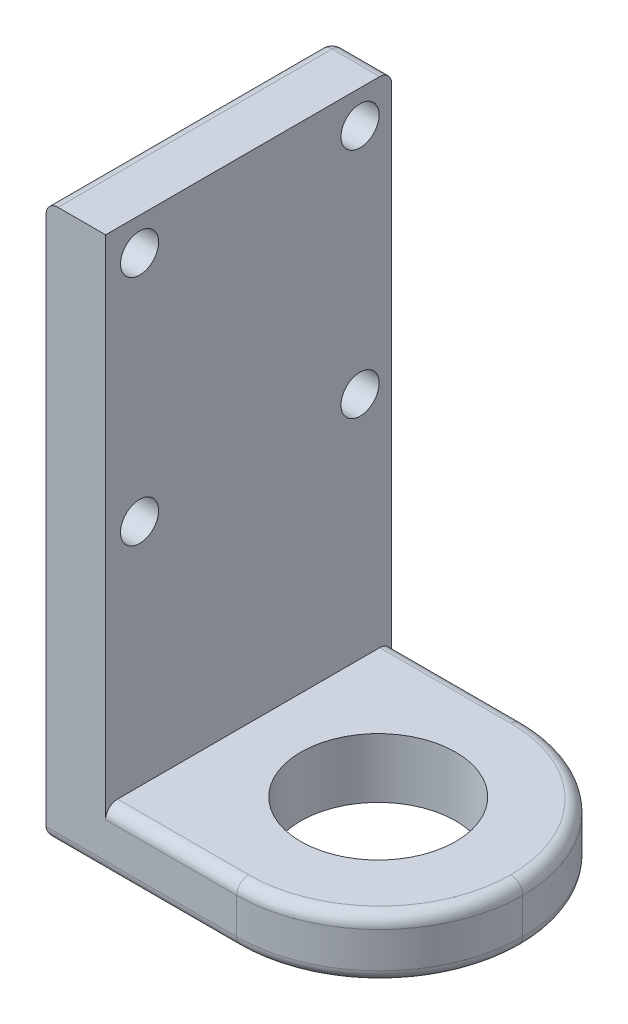
ISO-10303-21;
HEADER;
FILE_DESCRIPTION(('STEP AP214'),'2;1');
FILE_NAME('part.step','',(''),(''),'','','');
FILE_SCHEMA(('AUTOMOTIVE_DESIGN { 1 0 10303 214 1 1 1 1 }'));
ENDSEC;
DATA;
#1=APPLICATION_CONTEXT('core data for automotive mechanical design processes');
#2=APPLICATION_PROTOCOL_DEFINITION('international standard','automotive_design',2000,#1);
#3=PRODUCT_CONTEXT('',#1,'mechanical');
#4=PRODUCT('Part','Part','',(#3));
#5=PRODUCT_RELATED_PRODUCT_CATEGORY('part','',(#4));
#6=PRODUCT_DEFINITION_FORMATION('','',#4);
#7=PRODUCT_DEFINITION_CONTEXT('part definition',#1,'design');
#8=PRODUCT_DEFINITION('design','',#6,#7);
#9=PRODUCT_DEFINITION_SHAPE('','',#8);
#10=(LENGTH_UNIT() NAMED_UNIT(*) SI_UNIT(.MILLI.,.METRE.));
#11=(NAMED_UNIT(*) PLANE_ANGLE_UNIT() SI_UNIT($,.RADIAN.));
#12=(NAMED_UNIT(*) SI_UNIT($,.STERADIAN.) SOLID_ANGLE_UNIT());
#13=UNCERTAINTY_MEASURE_WITH_UNIT(LENGTH_MEASURE(1.E-05),#10,'distance_accuracy_value','');
#14=(GEOMETRIC_REPRESENTATION_CONTEXT(3) GLOBAL_UNCERTAINTY_ASSIGNED_CONTEXT((#13)) GLOBAL_UNIT_ASSIGNED_CONTEXT((#10,
#11,#12)) REPRESENTATION_CONTEXT('',''));
#15=CARTESIAN_POINT('',(0.,0.,0.));
#16=DIRECTION('',(0.,0.,1.));
#17=DIRECTION('',(1.,0.,0.));
#18=AXIS2_PLACEMENT_3D('',#15,#16,#17);
#19=CARTESIAN_POINT('',(-34.8231190346239,0.,0.));
#20=DIRECTION('',(1.,0.,0.));
#21=DIRECTION('',(0.,0.,-1.));
#22=AXIS2_PLACEMENT_3D('',#19,#20,#21);
#23=PLANE('',#22);
#24=DIRECTION('',(0.,1.,0.));
#25=VECTOR('',#24,1.);
#26=CARTESIAN_POINT('',(-34.8231190346239,41.0126169361447,-22.7550836152464));
#27=LINE('',#26,#25);
#28=CARTESIAN_POINT('',(-34.8231190346239,-4.48738306385536,-22.7550836152464));
#29=VERTEX_POINT('',#28);
#30=CARTESIAN_POINT('',(-34.8231190346239,40.0126169361447,-22.7550836152464));
#31=VERTEX_POINT('',#30);
#32=EDGE_CURVE('E144',#29,#31,#27,.T.);
#33=ORIENTED_EDGE('',*,*,#32,.T.);
#34=DIRECTION('',(0.,0.,-1.));
#35=VECTOR('',#34,1.);
#36=CARTESIAN_POINT('',(-34.8231190346239,40.0126169361447,0.));
#37=LINE('',#36,#35);
#38=CARTESIAN_POINT('',(-34.8231190346239,40.0126169361447,-45.7550836152464));
#39=VERTEX_POINT('',#38);
#40=EDGE_CURVE('E42',#31,#39,#37,.T.);
#41=ORIENTED_EDGE('',*,*,#40,.T.);
#42=DIRECTION('',(0.,-1.,0.));
#43=VECTOR('',#42,1.);
#44=CARTESIAN_POINT('',(-34.8231190346239,0.,-45.7550836152464));
#45=LINE('',#44,#43);
#46=CARTESIAN_POINT('',(-34.8231190346239,-4.48738306385536,-45.7550836152464));
#47=VERTEX_POINT('',#46);
#48=EDGE_CURVE('E308',#39,#47,#45,.T.);
#49=ORIENTED_EDGE('',*,*,#48,.T.);
#50=DIRECTION('',(0.,0.,1.));
#51=VECTOR('',#50,1.);
#52=CARTESIAN_POINT('',(-34.8231190346239,-4.48738306385536,0.));
#53=LINE('',#52,#51);
#54=EDGE_CURVE('E305',#47,#29,#53,.T.);
#55=ORIENTED_EDGE('',*,*,#54,.T.);
#56=EDGE_LOOP('',(#33,#41,#49,#55));
#57=FACE_BOUND('',#56,.T.);
#58=CARTESIAN_POINT('',(-34.8231190346239,38.2626169361447,-44.1050836152464));
#59=DIRECTION('',(-1.,0.,0.));
#60=DIRECTION('',(0.,0.,1.));
#61=AXIS2_PLACEMENT_3D('',#58,#59,#60);
#62=CIRCLE('',#61,1.6);
#63=CARTESIAN_POINT('',(-34.8231190346239,38.2626169361447,-42.5050836152464));
#64=VERTEX_POINT('',#63);
#65=EDGE_CURVE('E229',#64,#64,#62,.T.);
#66=ORIENTED_EDGE('',*,*,#65,.F.);
#67=EDGE_LOOP('',(#66));
#68=FACE_BOUND('',#67,.T.);
#69=CARTESIAN_POINT('',(-34.8231190346239,38.2626169361447,-25.6050836152464));
#70=DIRECTION('',(-1.,0.,0.));
#71=DIRECTION('',(0.,0.,1.));
#72=AXIS2_PLACEMENT_3D('',#69,#70,#71);
#73=CIRCLE('',#72,1.6);
#74=CARTESIAN_POINT('',(-34.8231190346239,38.2626169361447,-24.0050836152464));
#75=VERTEX_POINT('',#74);
#76=EDGE_CURVE('E223',#75,#75,#73,.T.);
#77=ORIENTED_EDGE('',*,*,#76,.F.);
#78=EDGE_LOOP('',(#77));
#79=FACE_BOUND('',#78,.T.);
#80=CARTESIAN_POINT('',(-34.8231190346239,18.7626169361446,-25.6050836152464));
#81=DIRECTION('',(-1.,0.,0.));
#82=DIRECTION('',(0.,0.,1.));
#83=AXIS2_PLACEMENT_3D('',#80,#81,#82);
#84=CIRCLE('',#83,1.6);
#85=CARTESIAN_POINT('',(-34.8231190346239,18.7626169361446,-24.0050836152464));
#86=VERTEX_POINT('',#85);
#87=EDGE_CURVE('E217',#86,#86,#84,.T.);
#88=ORIENTED_EDGE('',*,*,#87,.F.);
#89=EDGE_LOOP('',(#88));
#90=FACE_BOUND('',#89,.T.);
#91=CARTESIAN_POINT('',(-34.8231190346239,18.7626169361446,-44.1050836152464));
#92=DIRECTION('',(-1.,0.,0.));
#93=DIRECTION('',(0.,0.,1.));
#94=AXIS2_PLACEMENT_3D('',#91,#92,#93);
#95=CIRCLE('',#94,1.6);
#96=CARTESIAN_POINT('',(-34.8231190346239,18.7626169361446,-42.5050836152464));
#97=VERTEX_POINT('',#96);
#98=EDGE_CURVE('E211',#97,#97,#95,.T.);
#99=ORIENTED_EDGE('',*,*,#98,.F.);
#100=EDGE_LOOP('',(#99));
#101=FACE_BOUND('',#100,.T.);
#102=ADVANCED_FACE('F33',(#57,#68,#79,#90,#101),#23,.F.);
#103=CARTESIAN_POINT('',(-29.8231190346239,0.,0.));
#104=DIRECTION('',(1.,0.,0.));
#105=DIRECTION('',(0.,0.,-1.));
#106=AXIS2_PLACEMENT_3D('',#103,#104,#105);
#107=PLANE('',#106);
#108=DIRECTION('',(0.,-1.,0.));
#109=VECTOR('',#108,1.);
#110=CARTESIAN_POINT('',(-29.8231190346239,41.0126169361447,-46.7550836152464));
#111=LINE('',#110,#109);
#112=CARTESIAN_POINT('',(-29.8231190346239,40.0126169361447,-46.7550836152464));
#113=VERTEX_POINT('',#112);
#114=CARTESIAN_POINT('',(-29.8231190346239,-1.48738306385536,-46.7550836152464));
#115=VERTEX_POINT('',#114);
#116=EDGE_CURVE('E154',#113,#115,#111,.T.);
#117=ORIENTED_EDGE('',*,*,#116,.F.);
#118=CARTESIAN_POINT('',(-29.8231190346239,40.0126169361447,-45.7550836152464));
#119=DIRECTION('',(1.,0.,0.));
#120=DIRECTION('',(0.,0.,-1.));
#121=AXIS2_PLACEMENT_3D('',#118,#119,#120);
#122=CIRCLE('',#121,1.);
#123=CARTESIAN_POINT('',(-29.8231190346239,41.0126169361447,-45.7550836152464));
#124=VERTEX_POINT('',#123);
#125=EDGE_CURVE('E160',#113,#124,#122,.T.);
#126=ORIENTED_EDGE('',*,*,#125,.T.);
#127=DIRECTION('',(0.,0.,-1.));
#128=VECTOR('',#127,1.);
#129=CARTESIAN_POINT('',(-29.8231190346239,41.0126169361447,-22.7550836152464));
#130=LINE('',#129,#128);
#131=CARTESIAN_POINT('',(-29.8231190346239,41.0126169361447,-22.7550836152464));
#132=VERTEX_POINT('',#131);
#133=EDGE_CURVE('E141',#132,#124,#130,.T.);
#134=ORIENTED_EDGE('',*,*,#133,.F.);
#135=DIRECTION('',(0.,1.,0.));
#136=VECTOR('',#135,1.);
#137=CARTESIAN_POINT('',(-29.8231190346239,41.0126169361447,-22.7550836152464));
#138=LINE('',#137,#136);
#139=CARTESIAN_POINT('',(-29.8231190346239,-1.48738306385536,-22.7550836152464));
#140=VERTEX_POINT('',#139);
#141=EDGE_CURVE('E147',#140,#132,#138,.T.);
#142=ORIENTED_EDGE('',*,*,#141,.F.);
#143=CARTESIAN_POINT('',(-29.8231190346239,-1.48738306385536,-23.7550836152464));
#144=DIRECTION('',(1.,0.,0.));
#145=DIRECTION('',(0.,0.,-1.));
#146=AXIS2_PLACEMENT_3D('',#143,#144,#145);
#147=CIRCLE('',#146,1.);
#148=CARTESIAN_POINT('',(-29.8231190346239,-0.48738306385536,-23.7550836152464));
#149=VERTEX_POINT('',#148);
#150=EDGE_CURVE('E319',#140,#149,#147,.F.);
#151=ORIENTED_EDGE('',*,*,#150,.T.);
#152=DIRECTION('',(0.,0.,1.));
#153=VECTOR('',#152,1.);
#154=CARTESIAN_POINT('',(-29.8231190346239,-0.487383063855357,-46.7550836152464));
#155=LINE('',#154,#153);
#156=CARTESIAN_POINT('',(-29.8231190346239,-0.487383063855358,-45.7550836152464));
#157=VERTEX_POINT('',#156);
#158=EDGE_CURVE('E200',#157,#149,#155,.T.);
#159=ORIENTED_EDGE('',*,*,#158,.F.);
#160=CARTESIAN_POINT('',(-29.8231190346239,-1.48738306385536,-45.7550836152464));
#161=DIRECTION('',(1.,0.,0.));
#162=DIRECTION('',(0.,0.,-1.));
#163=AXIS2_PLACEMENT_3D('',#160,#161,#162);
#164=CIRCLE('',#163,1.);
#165=EDGE_CURVE('E279',#157,#115,#164,.F.);
#166=ORIENTED_EDGE('',*,*,#165,.T.);
#167=EDGE_LOOP('',(#117,#126,#134,#142,#151,#159,#166));
#168=FACE_BOUND('',#167,.T.);
#169=CARTESIAN_POINT('',(-29.8231190346239,18.7626169361446,-25.6050836152464));
#170=DIRECTION('',(-1.,0.,0.));
#171=DIRECTION('',(0.,0.,1.));
#172=AXIS2_PLACEMENT_3D('',#169,#170,#171);
#173=CIRCLE('',#172,1.6);
#174=CARTESIAN_POINT('',(-29.8231190346239,18.7626169361446,-24.0050836152464));
#175=VERTEX_POINT('',#174);
#176=EDGE_CURVE('E214',#175,#175,#173,.T.);
#177=ORIENTED_EDGE('',*,*,#176,.T.);
#178=EDGE_LOOP('',(#177));
#179=FACE_BOUND('',#178,.T.);
#180=CARTESIAN_POINT('',(-29.8231190346239,38.2626169361447,-44.1050836152464));
#181=DIRECTION('',(-1.,0.,0.));
#182=DIRECTION('',(0.,0.,1.));
#183=AXIS2_PLACEMENT_3D('',#180,#181,#182);
#184=CIRCLE('',#183,1.6);
#185=CARTESIAN_POINT('',(-29.8231190346239,38.2626169361447,-42.5050836152464));
#186=VERTEX_POINT('',#185);
#187=EDGE_CURVE('E226',#186,#186,#184,.T.);
#188=ORIENTED_EDGE('',*,*,#187,.T.);
#189=EDGE_LOOP('',(#188));
#190=FACE_BOUND('',#189,.T.);
#191=CARTESIAN_POINT('',(-29.8231190346239,38.2626169361447,-25.6050836152464));
#192=DIRECTION('',(-1.,0.,0.));
#193=DIRECTION('',(0.,0.,1.));
#194=AXIS2_PLACEMENT_3D('',#191,#192,#193);
#195=CIRCLE('',#194,1.6);
#196=CARTESIAN_POINT('',(-29.8231190346239,38.2626169361447,-24.0050836152464));
#197=VERTEX_POINT('',#196);
#198=EDGE_CURVE('E220',#197,#197,#195,.T.);
#199=ORIENTED_EDGE('',*,*,#198,.T.);
#200=EDGE_LOOP('',(#199));
#201=FACE_BOUND('',#200,.T.);
#202=CARTESIAN_POINT('',(-29.8231190346239,18.7626169361446,-44.1050836152464));
#203=DIRECTION('',(-1.,0.,0.));
#204=DIRECTION('',(0.,0.,1.));
#205=AXIS2_PLACEMENT_3D('',#202,#203,#204);
#206=CIRCLE('',#205,1.6);
#207=CARTESIAN_POINT('',(-29.8231190346239,18.7626169361446,-42.5050836152464));
#208=VERTEX_POINT('',#207);
#209=EDGE_CURVE('E204',#208,#208,#206,.T.);
#210=ORIENTED_EDGE('',*,*,#209,.T.);
#211=EDGE_LOOP('',(#210));
#212=FACE_BOUND('',#211,.T.);
#213=ADVANCED_FACE('F157',(#168,#179,#190,#201,#212),#107,.T.);
#214=CARTESIAN_POINT('',(-34.8231190346239,41.0126169361447,-46.7550836152464));
#215=DIRECTION('',(0.,0.,1.));
#216=DIRECTION('',(1.,0.,0.));
#217=AXIS2_PLACEMENT_3D('',#214,#215,#216);
#218=PLANE('',#217);
#219=DIRECTION('',(0.,-1.,0.));
#220=VECTOR('',#219,1.);
#221=CARTESIAN_POINT('',(-33.8231190346239,41.0126169361447,-46.7550836152464));
#222=LINE('',#221,#220);
#223=CARTESIAN_POINT('',(-33.8231190346239,-4.48738306385536,-46.7550836152464));
#224=VERTEX_POINT('',#223);
#225=CARTESIAN_POINT('',(-33.8231190346239,40.0126169361447,-46.7550836152464));
#226=VERTEX_POINT('',#225);
#227=EDGE_CURVE('E317',#224,#226,#222,.F.);
#228=ORIENTED_EDGE('',*,*,#227,.T.);
#229=DIRECTION('',(1.,0.,0.));
#230=VECTOR('',#229,1.);
#231=CARTESIAN_POINT('',(-34.8231190346239,40.0126169361447,-46.7550836152464));
#232=LINE('',#231,#230);
#233=EDGE_CURVE('E239',#226,#113,#232,.T.);
#234=ORIENTED_EDGE('',*,*,#233,.T.);
#235=ORIENTED_EDGE('',*,*,#116,.T.);
#236=DIRECTION('',(-1.,0.,0.));
#237=VECTOR('',#236,1.);
#238=CARTESIAN_POINT('',(-34.8231190346239,-1.48738306385536,-46.7550836152464));
#239=LINE('',#238,#237);
#240=CARTESIAN_POINT('',(-18.8231190346239,-1.48738306385536,-46.7550836152464));
#241=VERTEX_POINT('',#240);
#242=EDGE_CURVE('E307',#115,#241,#239,.F.);
#243=ORIENTED_EDGE('',*,*,#242,.T.);
#244=DIRECTION('',(0.,1.,0.));
#245=VECTOR('',#244,1.);
#246=CARTESIAN_POINT('',(-18.8231190346239,-5.48738306385536,-46.7550836152464));
#247=LINE('',#246,#245);
#248=CARTESIAN_POINT('',(-18.8231190346239,-4.48738306385536,-46.7550836152464));
#249=VERTEX_POINT('',#248);
#250=EDGE_CURVE('E168',#241,#249,#247,.F.);
#251=ORIENTED_EDGE('',*,*,#250,.T.);
#252=DIRECTION('',(1.,0.,0.));
#253=VECTOR('',#252,1.);
#254=CARTESIAN_POINT('',(-34.8231190346239,-4.48738306385536,-46.7550836152464));
#255=LINE('',#254,#253);
#256=EDGE_CURVE('E310',#249,#224,#255,.F.);
#257=ORIENTED_EDGE('',*,*,#256,.T.);
#258=EDGE_LOOP('',(#228,#234,#235,#243,#251,#257));
#259=FACE_BOUND('',#258,.T.);
#260=ADVANCED_FACE('F330',(#259),#218,.F.);
#261=CARTESIAN_POINT('',(-34.8231190346239,-5.48738306385536,-22.7550836152464));
#262=DIRECTION('',(0.,1.,0.));
#263=DIRECTION('',(0.,0.,1.));
#264=AXIS2_PLACEMENT_3D('',#261,#262,#263);
#265=PLANE('',#264);
#266=CARTESIAN_POINT('',(-18.8231190346239,-5.48738306385536,-34.7550836152464));
#267=DIRECTION('',(0.,1.,0.));
#268=DIRECTION('',(0.,0.,1.));
#269=AXIS2_PLACEMENT_3D('',#266,#267,#268);
#270=CIRCLE('',#269,11.);
#271=CARTESIAN_POINT('',(-7.82311903462387,-5.48738306385536,-34.7550836152464));
#272=VERTEX_POINT('',#271);
#273=CARTESIAN_POINT('',(-18.8231190346239,-5.48738306385536,-23.7550836152464));
#274=VERTEX_POINT('',#273);
#275=EDGE_CURVE('E186',#272,#274,#270,.F.);
#276=ORIENTED_EDGE('',*,*,#275,.T.);
#277=DIRECTION('',(1.,0.,0.));
#278=VECTOR('',#277,1.);
#279=CARTESIAN_POINT('',(-34.8231190346239,-5.48738306385536,-23.7550836152464));
#280=LINE('',#279,#278);
#281=CARTESIAN_POINT('',(-33.8231190346239,-5.48738306385536,-23.7550836152464));
#282=VERTEX_POINT('',#281);
#283=EDGE_CURVE('E188',#274,#282,#280,.F.);
#284=ORIENTED_EDGE('',*,*,#283,.T.);
#285=DIRECTION('',(0.,0.,1.));
#286=VECTOR('',#285,1.);
#287=CARTESIAN_POINT('',(-33.8231190346239,-5.48738306385536,-22.7550836152464));
#288=LINE('',#287,#286);
#289=CARTESIAN_POINT('',(-33.8231190346239,-5.48738306385536,-45.7550836152464));
#290=VERTEX_POINT('',#289);
#291=EDGE_CURVE('E182',#282,#290,#288,.F.);
#292=ORIENTED_EDGE('',*,*,#291,.T.);
#293=DIRECTION('',(1.,0.,0.));
#294=VECTOR('',#293,1.);
#295=CARTESIAN_POINT('',(-34.8231190346239,-5.48738306385536,-45.7550836152464));
#296=LINE('',#295,#294);
#297=CARTESIAN_POINT('',(-18.8231190346239,-5.48738306385536,-45.7550836152464));
#298=VERTEX_POINT('',#297);
#299=EDGE_CURVE('E180',#290,#298,#296,.T.);
#300=ORIENTED_EDGE('',*,*,#299,.T.);
#301=CARTESIAN_POINT('',(-18.8231190346239,-5.48738306385536,-34.7550836152464));
#302=DIRECTION('',(0.,1.,0.));
#303=DIRECTION('',(0.,0.,1.));
#304=AXIS2_PLACEMENT_3D('',#301,#302,#303);
#305=CIRCLE('',#304,11.);
#306=EDGE_CURVE('E184',#298,#272,#305,.F.);
#307=ORIENTED_EDGE('',*,*,#306,.T.);
#308=EDGE_LOOP('',(#276,#284,#292,#300,#307));
#309=FACE_BOUND('',#308,.T.);
#310=CARTESIAN_POINT('',(-19.0474803844956,-5.48738306385536,-34.8550836152464));
#311=DIRECTION('',(0.,-1.,0.));
#312=DIRECTION('',(0.,0.,-1.));
#313=AXIS2_PLACEMENT_3D('',#310,#311,#312);
#314=CIRCLE('',#313,6.5);
#315=CARTESIAN_POINT('',(-19.0474803844956,-5.48738306385536,-41.3550836152464));
#316=VERTEX_POINT('',#315);
#317=EDGE_CURVE('E174',#316,#316,#314,.T.);
#318=ORIENTED_EDGE('',*,*,#317,.F.);
#319=EDGE_LOOP('',(#318));
#320=FACE_BOUND('',#319,.T.);
#321=ADVANCED_FACE('F341',(#309,#320),#265,.F.);
#322=CARTESIAN_POINT('',(-34.8231190346239,41.0126169361447,-22.7550836152464));
#323=DIRECTION('',(0.,0.,-1.));
#324=DIRECTION('',(-1.,0.,0.));
#325=AXIS2_PLACEMENT_3D('',#322,#323,#324);
#326=PLANE('',#325);
#327=DIRECTION('',(1.,0.,0.));
#328=VECTOR('',#327,1.);
#329=CARTESIAN_POINT('',(-34.8231190346239,41.0126169361447,-22.7550836152464));
#330=LINE('',#329,#328);
#331=CARTESIAN_POINT('',(-33.8231190346239,41.0126169361447,-22.7550836152464));
#332=VERTEX_POINT('',#331);
#333=EDGE_CURVE('E137',#332,#132,#330,.T.);
#334=ORIENTED_EDGE('',*,*,#333,.F.);
#335=CARTESIAN_POINT('',(-33.8231190346239,40.0126169361447,-22.7550836152464));
#336=DIRECTION('',(0.,0.,-1.));
#337=DIRECTION('',(-1.,0.,0.));
#338=AXIS2_PLACEMENT_3D('',#335,#336,#337);
#339=CIRCLE('',#338,1.);
#340=EDGE_CURVE('E11',#332,#31,#339,.F.);
#341=ORIENTED_EDGE('',*,*,#340,.T.);
#342=ORIENTED_EDGE('',*,*,#32,.F.);
#343=DIRECTION('',(1.,0.,0.));
#344=VECTOR('',#343,1.);
#345=CARTESIAN_POINT('',(-34.8231190346239,-4.48738306385536,-22.7550836152464));
#346=LINE('',#345,#344);
#347=CARTESIAN_POINT('',(-18.8231190346239,-4.48738306385536,-22.7550836152464));
#348=VERTEX_POINT('',#347);
#349=EDGE_CURVE('E177',#29,#348,#346,.T.);
#350=ORIENTED_EDGE('',*,*,#349,.T.);
#351=DIRECTION('',(0.,-1.,0.));
#352=VECTOR('',#351,1.);
#353=CARTESIAN_POINT('',(-18.8231190346239,-0.48738306385536,-22.7550836152464));
#354=LINE('',#353,#352);
#355=CARTESIAN_POINT('',(-18.8231190346239,-1.48738306385536,-22.7550836152464));
#356=VERTEX_POINT('',#355);
#357=EDGE_CURVE('E143',#348,#356,#354,.F.);
#358=ORIENTED_EDGE('',*,*,#357,.T.);
#359=DIRECTION('',(-1.,0.,0.));
#360=VECTOR('',#359,1.);
#361=CARTESIAN_POINT('',(-34.8231190346239,-1.48738306385536,-22.7550836152464));
#362=LINE('',#361,#360);
#363=EDGE_CURVE('E151',#356,#140,#362,.T.);
#364=ORIENTED_EDGE('',*,*,#363,.T.);
#365=ORIENTED_EDGE('',*,*,#141,.T.);
#366=EDGE_LOOP('',(#334,#341,#342,#350,#358,#364,#365));
#367=FACE_BOUND('',#366,.T.);
#368=ADVANCED_FACE('F148',(#367),#326,.F.);
#369=CARTESIAN_POINT('',(-34.8231190346239,41.0126169361447,-22.7550836152464));
#370=DIRECTION('',(0.,-1.,0.));
#371=DIRECTION('',(0.,0.,-1.));
#372=AXIS2_PLACEMENT_3D('',#369,#370,#371);
#373=PLANE('',#372);
#374=ORIENTED_EDGE('',*,*,#133,.T.);
#375=DIRECTION('',(1.,0.,0.));
#376=VECTOR('',#375,1.);
#377=CARTESIAN_POINT('',(-34.8231190346239,41.0126169361447,-45.7550836152464));
#378=LINE('',#377,#376);
#379=CARTESIAN_POINT('',(-33.8231190346239,41.0126169361447,-45.7550836152464));
#380=VERTEX_POINT('',#379);
#381=EDGE_CURVE('E56',#124,#380,#378,.F.);
#382=ORIENTED_EDGE('',*,*,#381,.T.);
#383=DIRECTION('',(0.,0.,-1.));
#384=VECTOR('',#383,1.);
#385=CARTESIAN_POINT('',(-33.8231190346239,41.0126169361447,-22.7550836152464));
#386=LINE('',#385,#384);
#387=EDGE_CURVE('E142',#380,#332,#386,.F.);
#388=ORIENTED_EDGE('',*,*,#387,.T.);
#389=ORIENTED_EDGE('',*,*,#333,.T.);
#390=EDGE_LOOP('',(#374,#382,#388,#389));
#391=FACE_BOUND('',#390,.T.);
#392=ADVANCED_FACE('F139',(#391),#373,.F.);
#393=CARTESIAN_POINT('',(-34.8231190346239,38.2626169361447,-44.1050836152464));
#394=DIRECTION('',(1.,0.,0.));
#395=DIRECTION('',(0.,0.,-1.));
#396=AXIS2_PLACEMENT_3D('',#393,#394,#395);
#397=CYLINDRICAL_SURFACE('',#396,1.6);
#398=ORIENTED_EDGE('',*,*,#65,.T.);
#399=EDGE_LOOP('',(#398));
#400=FACE_BOUND('',#399,.T.);
#401=ORIENTED_EDGE('',*,*,#187,.F.);
#402=EDGE_LOOP('',(#401));
#403=FACE_BOUND('',#402,.T.);
#404=ADVANCED_FACE('F383',(#400,#403),#397,.F.);
#405=CARTESIAN_POINT('',(-34.8231190346239,38.2626169361447,-25.6050836152464));
#406=DIRECTION('',(1.,0.,0.));
#407=DIRECTION('',(0.,0.,-1.));
#408=AXIS2_PLACEMENT_3D('',#405,#406,#407);
#409=CYLINDRICAL_SURFACE('',#408,1.6);
#410=ORIENTED_EDGE('',*,*,#76,.T.);
#411=EDGE_LOOP('',(#410));
#412=FACE_BOUND('',#411,.T.);
#413=ORIENTED_EDGE('',*,*,#198,.F.);
#414=EDGE_LOOP('',(#413));
#415=FACE_BOUND('',#414,.T.);
#416=ADVANCED_FACE('F590',(#412,#415),#409,.F.);
#417=CARTESIAN_POINT('',(-34.8231190346239,18.7626169361446,-25.6050836152464));
#418=DIRECTION('',(1.,0.,0.));
#419=DIRECTION('',(0.,0.,-1.));
#420=AXIS2_PLACEMENT_3D('',#417,#418,#419);
#421=CYLINDRICAL_SURFACE('',#420,1.6);
#422=ORIENTED_EDGE('',*,*,#87,.T.);
#423=EDGE_LOOP('',(#422));
#424=FACE_BOUND('',#423,.T.);
#425=ORIENTED_EDGE('',*,*,#176,.F.);
#426=EDGE_LOOP('',(#425));
#427=FACE_BOUND('',#426,.T.);
#428=ADVANCED_FACE('F580',(#424,#427),#421,.F.);
#429=CARTESIAN_POINT('',(-34.8231190346239,18.7626169361446,-44.1050836152464));
#430=DIRECTION('',(1.,0.,0.));
#431=DIRECTION('',(0.,0.,-1.));
#432=AXIS2_PLACEMENT_3D('',#429,#430,#431);
#433=CYLINDRICAL_SURFACE('',#432,1.6);
#434=ORIENTED_EDGE('',*,*,#98,.T.);
#435=EDGE_LOOP('',(#434));
#436=FACE_BOUND('',#435,.T.);
#437=ORIENTED_EDGE('',*,*,#209,.F.);
#438=EDGE_LOOP('',(#437));
#439=FACE_BOUND('',#438,.T.);
#440=ADVANCED_FACE('F558',(#436,#439),#433,.F.);
#441=CARTESIAN_POINT('',(-6.82311903462388,-0.487383063855357,-46.7550836152464));
#442=DIRECTION('',(0.,-1.,0.));
#443=DIRECTION('',(0.,0.,-1.));
#444=AXIS2_PLACEMENT_3D('',#441,#442,#443);
#445=PLANE('',#444);
#446=CARTESIAN_POINT('',(-19.0474803844956,-0.487383063855359,-34.8550836152464));
#447=DIRECTION('',(0.,-1.,0.));
#448=DIRECTION('',(0.,0.,-1.));
#449=AXIS2_PLACEMENT_3D('',#446,#447,#448);
#450=CIRCLE('',#449,6.5);
#451=CARTESIAN_POINT('',(-19.0474803844956,-0.487383063855359,-41.3550836152464));
#452=VERTEX_POINT('',#451);
#453=EDGE_CURVE('E205',#452,#452,#450,.F.);
#454=ORIENTED_EDGE('',*,*,#453,.F.);
#455=EDGE_LOOP('',(#454));
#456=FACE_BOUND('',#455,.T.);
#457=ORIENTED_EDGE('',*,*,#158,.T.);
#458=DIRECTION('',(-1.,0.,0.));
#459=VECTOR('',#458,1.);
#460=CARTESIAN_POINT('',(-6.82311903462387,-0.48738306385536,-23.7550836152464));
#461=LINE('',#460,#459);
#462=CARTESIAN_POINT('',(-18.8231190346239,-0.48738306385536,-23.7550836152464));
#463=VERTEX_POINT('',#462);
#464=EDGE_CURVE('E312',#149,#463,#461,.F.);
#465=ORIENTED_EDGE('',*,*,#464,.T.);
#466=CARTESIAN_POINT('',(-18.8231190346239,-0.487383063855359,-34.7550836152464));
#467=DIRECTION('',(0.,-1.,0.));
#468=DIRECTION('',(0.,0.,-1.));
#469=AXIS2_PLACEMENT_3D('',#466,#467,#468);
#470=CIRCLE('',#469,11.);
#471=CARTESIAN_POINT('',(-7.82311903462387,-0.487383063855359,-34.7550836152464));
#472=VERTEX_POINT('',#471);
#473=EDGE_CURVE('E355',#463,#472,#470,.F.);
#474=ORIENTED_EDGE('',*,*,#473,.T.);
#475=CARTESIAN_POINT('',(-18.8231190346239,-0.487383063855359,-34.7550836152464));
#476=DIRECTION('',(0.,-1.,0.));
#477=DIRECTION('',(0.,0.,-1.));
#478=AXIS2_PLACEMENT_3D('',#475,#476,#477);
#479=CIRCLE('',#478,11.);
#480=CARTESIAN_POINT('',(-18.8231190346239,-0.487383063855358,-45.7550836152464));
#481=VERTEX_POINT('',#480);
#482=EDGE_CURVE('E358',#472,#481,#479,.F.);
#483=ORIENTED_EDGE('',*,*,#482,.T.);
#484=DIRECTION('',(-1.,0.,0.));
#485=VECTOR('',#484,1.);
#486=CARTESIAN_POINT('',(-6.82311903462388,-0.487383063855358,-45.7550836152464));
#487=LINE('',#486,#485);
#488=EDGE_CURVE('E199',#481,#157,#487,.T.);
#489=ORIENTED_EDGE('',*,*,#488,.T.);
#490=EDGE_LOOP('',(#457,#465,#474,#483,#489));
#491=FACE_BOUND('',#490,.T.);
#492=ADVANCED_FACE('F361',(#456,#491),#445,.F.);
#493=CARTESIAN_POINT('',(-19.0474803844956,41.0136419361447,-34.8550836152464));
#494=DIRECTION('',(0.,-1.,0.));
#495=DIRECTION('',(0.,0.,-1.));
#496=AXIS2_PLACEMENT_3D('',#493,#494,#495);
#497=CYLINDRICAL_SURFACE('',#496,6.5);
#498=ORIENTED_EDGE('',*,*,#317,.T.);
#499=EDGE_LOOP('',(#498));
#500=FACE_BOUND('',#499,.T.);
#501=ORIENTED_EDGE('',*,*,#453,.T.);
#502=EDGE_LOOP('',(#501));
#503=FACE_BOUND('',#502,.T.);
#504=ADVANCED_FACE('F398',(#500,#503),#497,.F.);
#505=CARTESIAN_POINT('',(-18.8231190346239,0.,-34.7550836152464));
#506=DIRECTION('',(0.,-1.,0.));
#507=DIRECTION('',(0.,0.,-1.));
#508=AXIS2_PLACEMENT_3D('',#505,#506,#507);
#509=CYLINDRICAL_SURFACE('',#508,12.);
#510=DIRECTION('',(0.,1.,0.));
#511=VECTOR('',#510,1.);
#512=CARTESIAN_POINT('',(-6.82311903462387,-0.487383063855357,-34.7550836152464));
#513=LINE('',#512,#511);
#514=CARTESIAN_POINT('',(-6.82311903462387,-4.48738306385536,-34.7550836152464));
#515=VERTEX_POINT('',#514);
#516=CARTESIAN_POINT('',(-6.82311903462387,-1.48738306385536,-34.7550836152464));
#517=VERTEX_POINT('',#516);
#518=EDGE_CURVE('E171',#515,#517,#513,.T.);
#519=ORIENTED_EDGE('',*,*,#518,.F.);
#520=CARTESIAN_POINT('',(-18.8231190346239,-4.48738306385536,-34.7550836152464));
#521=DIRECTION('',(0.,1.,0.));
#522=DIRECTION('',(0.,0.,1.));
#523=AXIS2_PLACEMENT_3D('',#520,#521,#522);
#524=CIRCLE('',#523,12.);
#525=EDGE_CURVE('E197',#515,#249,#524,.T.);
#526=ORIENTED_EDGE('',*,*,#525,.T.);
#527=ORIENTED_EDGE('',*,*,#250,.F.);
#528=CARTESIAN_POINT('',(-18.8231190346239,-1.48738306385536,-34.7550836152464));
#529=DIRECTION('',(0.,-1.,0.));
#530=DIRECTION('',(0.,0.,-1.));
#531=AXIS2_PLACEMENT_3D('',#528,#529,#530);
#532=CIRCLE('',#531,12.);
#533=EDGE_CURVE('E195',#241,#517,#532,.T.);
#534=ORIENTED_EDGE('',*,*,#533,.T.);
#535=EDGE_LOOP('',(#519,#526,#527,#534));
#536=FACE_BOUND('',#535,.T.);
#537=ADVANCED_FACE('F365',(#536),#509,.T.);
#538=CARTESIAN_POINT('',(-18.8231190346239,0.,-34.7550836152464));
#539=DIRECTION('',(0.,1.,0.));
#540=DIRECTION('',(0.,0.,1.));
#541=AXIS2_PLACEMENT_3D('',#538,#539,#540);
#542=CYLINDRICAL_SURFACE('',#541,12.);
#543=ORIENTED_EDGE('',*,*,#357,.F.);
#544=CARTESIAN_POINT('',(-18.8231190346239,-4.48738306385536,-34.7550836152464));
#545=DIRECTION('',(0.,1.,0.));
#546=DIRECTION('',(0.,0.,1.));
#547=AXIS2_PLACEMENT_3D('',#544,#545,#546);
#548=CIRCLE('',#547,12.);
#549=EDGE_CURVE('E193',#348,#515,#548,.T.);
#550=ORIENTED_EDGE('',*,*,#549,.T.);
#551=ORIENTED_EDGE('',*,*,#518,.T.);
#552=CARTESIAN_POINT('',(-18.8231190346239,-1.48738306385536,-34.7550836152464));
#553=DIRECTION('',(0.,-1.,0.));
#554=DIRECTION('',(0.,0.,-1.));
#555=AXIS2_PLACEMENT_3D('',#552,#553,#554);
#556=CIRCLE('',#555,12.);
#557=EDGE_CURVE('E191',#517,#356,#556,.T.);
#558=ORIENTED_EDGE('',*,*,#557,.T.);
#559=EDGE_LOOP('',(#543,#550,#551,#558));
#560=FACE_BOUND('',#559,.T.);
#561=ADVANCED_FACE('F349',(#560),#542,.T.);
#562=CARTESIAN_POINT('',(-33.8231190346239,0.,-45.7550836152464));
#563=DIRECTION('',(0.,-1.,0.));
#564=DIRECTION('',(0.,0.,-1.));
#565=AXIS2_PLACEMENT_3D('',#562,#563,#564);
#566=CYLINDRICAL_SURFACE('',#565,1.);
#567=ORIENTED_EDGE('',*,*,#48,.F.);
#568=CARTESIAN_POINT('',(-33.8231190346239,40.0126169361447,-45.7550836152464));
#569=DIRECTION('',(0.,-1.,0.));
#570=DIRECTION('',(0.,0.,-1.));
#571=AXIS2_PLACEMENT_3D('',#568,#569,#570);
#572=CIRCLE('',#571,1.);
#573=EDGE_CURVE('E237',#39,#226,#572,.T.);
#574=ORIENTED_EDGE('',*,*,#573,.T.);
#575=ORIENTED_EDGE('',*,*,#227,.F.);
#576=CARTESIAN_POINT('',(-33.8231190346239,-4.48738306385536,-45.7550836152464));
#577=DIRECTION('',(0.,-1.,0.));
#578=DIRECTION('',(0.,0.,-1.));
#579=AXIS2_PLACEMENT_3D('',#576,#577,#578);
#580=CIRCLE('',#579,1.);
#581=EDGE_CURVE('E289',#47,#224,#580,.T.);
#582=ORIENTED_EDGE('',*,*,#581,.F.);
#583=EDGE_LOOP('',(#567,#574,#575,#582));
#584=FACE_BOUND('',#583,.T.);
#585=ADVANCED_FACE('F328',(#584),#566,.T.);
#586=CARTESIAN_POINT('',(-34.8231190346239,-4.48738306385536,-45.7550836152464));
#587=DIRECTION('',(1.,0.,0.));
#588=DIRECTION('',(0.,0.,-1.));
#589=AXIS2_PLACEMENT_3D('',#586,#587,#588);
#590=CYLINDRICAL_SURFACE('',#589,1.);
#591=CARTESIAN_POINT('',(-33.8231190346239,-4.48738306385536,-45.7550836152464));
#592=DIRECTION('',(-1.,0.,0.));
#593=DIRECTION('',(0.,0.,1.));
#594=AXIS2_PLACEMENT_3D('',#591,#592,#593);
#595=CIRCLE('',#594,1.);
#596=EDGE_CURVE('E175',#224,#290,#595,.T.);
#597=ORIENTED_EDGE('',*,*,#596,.F.);
#598=ORIENTED_EDGE('',*,*,#256,.F.);
#599=CARTESIAN_POINT('',(-18.8231190346239,-4.48738306385536,-45.7550836152464));
#600=DIRECTION('',(1.,0.,0.));
#601=DIRECTION('',(0.,0.,-1.));
#602=AXIS2_PLACEMENT_3D('',#599,#600,#601);
#603=CIRCLE('',#602,1.);
#604=EDGE_CURVE('E287',#298,#249,#603,.T.);
#605=ORIENTED_EDGE('',*,*,#604,.F.);
#606=ORIENTED_EDGE('',*,*,#299,.F.);
#607=EDGE_LOOP('',(#597,#598,#605,#606));
#608=FACE_BOUND('',#607,.T.);
#609=ADVANCED_FACE('F333',(#608),#590,.T.);
#610=CARTESIAN_POINT('',(-33.8231190346239,-4.48738306385536,-45.7550836152464));
#611=DIRECTION('',(0.,0.,1.));
#612=DIRECTION('',(1.,0.,0.));
#613=AXIS2_PLACEMENT_3D('',#610,#611,#612);
#614=SPHERICAL_SURFACE('',#613,1.);
#615=ORIENTED_EDGE('',*,*,#581,.T.);
#616=ORIENTED_EDGE('',*,*,#596,.T.);
#617=CARTESIAN_POINT('',(-33.8231190346239,-4.48738306385536,-45.7550836152464));
#618=DIRECTION('',(0.,0.,-1.));
#619=DIRECTION('',(-1.,0.,0.));
#620=AXIS2_PLACEMENT_3D('',#617,#618,#619);
#621=CIRCLE('',#620,1.);
#622=EDGE_CURVE('E284',#47,#290,#621,.F.);
#623=ORIENTED_EDGE('',*,*,#622,.F.);
#624=EDGE_LOOP('',(#615,#616,#623));
#625=FACE_BOUND('',#624,.T.);
#626=ADVANCED_FACE('F296',(#625),#614,.T.);
#627=CARTESIAN_POINT('',(-18.8231190346239,-4.48738306385536,-34.7550836152464));
#628=DIRECTION('',(0.,1.,0.));
#629=DIRECTION('',(0.,0.,1.));
#630=AXIS2_PLACEMENT_3D('',#627,#628,#629);
#631=TOROIDAL_SURFACE('',#630,11.,1.);
#632=ORIENTED_EDGE('',*,*,#604,.T.);
#633=ORIENTED_EDGE('',*,*,#525,.F.);
#634=CARTESIAN_POINT('',(-7.82311903462387,-4.48738306385536,-34.7550836152464));
#635=DIRECTION('',(0.,0.,1.));
#636=DIRECTION('',(1.,0.,0.));
#637=AXIS2_PLACEMENT_3D('',#634,#635,#636);
#638=CIRCLE('',#637,1.);
#639=EDGE_CURVE('E276',#272,#515,#638,.T.);
#640=ORIENTED_EDGE('',*,*,#639,.F.);
#641=ORIENTED_EDGE('',*,*,#306,.F.);
#642=EDGE_LOOP('',(#632,#633,#640,#641));
#643=FACE_BOUND('',#642,.T.);
#644=ADVANCED_FACE('F337',(#643),#631,.T.);
#645=CARTESIAN_POINT('',(-33.8231190346239,-4.48738306385536,0.));
#646=DIRECTION('',(0.,0.,1.));
#647=DIRECTION('',(1.,0.,0.));
#648=AXIS2_PLACEMENT_3D('',#645,#646,#647);
#649=CYLINDRICAL_SURFACE('',#648,1.);
#650=ORIENTED_EDGE('',*,*,#622,.T.);
#651=ORIENTED_EDGE('',*,*,#291,.F.);
#652=CARTESIAN_POINT('',(-33.8231190346239,-4.48738306385536,-23.7550836152464));
#653=DIRECTION('',(0.707106781186548,0.,0.707106781186547));
#654=DIRECTION('',(-0.707106781186547,0.,0.707106781186548));
#655=AXIS2_PLACEMENT_3D('',#652,#653,#654);
#656=ELLIPSE('',#655,1.41421356237309,1.);
#657=EDGE_CURVE('E269',#29,#282,#656,.T.);
#658=ORIENTED_EDGE('',*,*,#657,.F.);
#659=ORIENTED_EDGE('',*,*,#54,.F.);
#660=EDGE_LOOP('',(#650,#651,#658,#659));
#661=FACE_BOUND('',#660,.T.);
#662=ADVANCED_FACE('F303',(#661),#649,.T.);
#663=CARTESIAN_POINT('',(-18.8231190346239,-4.48738306385536,-34.7550836152464));
#664=DIRECTION('',(0.,1.,0.));
#665=DIRECTION('',(0.,0.,1.));
#666=AXIS2_PLACEMENT_3D('',#663,#664,#665);
#667=TOROIDAL_SURFACE('',#666,11.,1.);
#668=ORIENTED_EDGE('',*,*,#639,.T.);
#669=ORIENTED_EDGE('',*,*,#549,.F.);
#670=CARTESIAN_POINT('',(-18.8231190346239,-4.48738306385536,-23.7550836152464));
#671=DIRECTION('',(-1.,0.,0.));
#672=DIRECTION('',(0.,0.,1.));
#673=AXIS2_PLACEMENT_3D('',#670,#671,#672);
#674=CIRCLE('',#673,1.);
#675=EDGE_CURVE('E264',#274,#348,#674,.T.);
#676=ORIENTED_EDGE('',*,*,#675,.F.);
#677=ORIENTED_EDGE('',*,*,#275,.F.);
#678=EDGE_LOOP('',(#668,#669,#676,#677));
#679=FACE_BOUND('',#678,.T.);
#680=ADVANCED_FACE('F345',(#679),#667,.T.);
#681=CARTESIAN_POINT('',(-34.8231190346239,-4.48738306385536,-23.7550836152464));
#682=DIRECTION('',(1.,0.,0.));
#683=DIRECTION('',(0.,0.,-1.));
#684=AXIS2_PLACEMENT_3D('',#681,#682,#683);
#685=CYLINDRICAL_SURFACE('',#684,1.);
#686=ORIENTED_EDGE('',*,*,#657,.T.);
#687=ORIENTED_EDGE('',*,*,#283,.F.);
#688=ORIENTED_EDGE('',*,*,#675,.T.);
#689=ORIENTED_EDGE('',*,*,#349,.F.);
#690=EDGE_LOOP('',(#686,#687,#688,#689));
#691=FACE_BOUND('',#690,.T.);
#692=ADVANCED_FACE('F343',(#691),#685,.T.);
#693=CARTESIAN_POINT('',(-6.82311903462388,-1.48738306385536,-45.7550836152464));
#694=DIRECTION('',(-1.,0.,0.));
#695=DIRECTION('',(0.,0.,1.));
#696=AXIS2_PLACEMENT_3D('',#693,#694,#695);
#697=CYLINDRICAL_SURFACE('',#696,1.);
#698=ORIENTED_EDGE('',*,*,#165,.F.);
#699=ORIENTED_EDGE('',*,*,#488,.F.);
#700=CARTESIAN_POINT('',(-18.8231190346239,-1.48738306385536,-45.7550836152464));
#701=DIRECTION('',(1.,0.,0.));
#702=DIRECTION('',(0.,0.,-1.));
#703=AXIS2_PLACEMENT_3D('',#700,#701,#702);
#704=CIRCLE('',#703,1.);
#705=EDGE_CURVE('E259',#241,#481,#704,.T.);
#706=ORIENTED_EDGE('',*,*,#705,.F.);
#707=ORIENTED_EDGE('',*,*,#242,.F.);
#708=EDGE_LOOP('',(#698,#699,#706,#707));
#709=FACE_BOUND('',#708,.T.);
#710=ADVANCED_FACE('F363',(#709),#697,.T.);
#711=CARTESIAN_POINT('',(-18.8231190346239,-1.48738306385536,-34.7550836152464));
#712=DIRECTION('',(0.,-1.,0.));
#713=DIRECTION('',(0.,0.,-1.));
#714=AXIS2_PLACEMENT_3D('',#711,#712,#713);
#715=TOROIDAL_SURFACE('',#714,11.,1.);
#716=ORIENTED_EDGE('',*,*,#705,.T.);
#717=ORIENTED_EDGE('',*,*,#482,.F.);
#718=CARTESIAN_POINT('',(-7.82311903462387,-1.48738306385536,-34.7550836152464));
#719=DIRECTION('',(0.,0.,1.));
#720=DIRECTION('',(1.,0.,0.));
#721=AXIS2_PLACEMENT_3D('',#718,#719,#720);
#722=CIRCLE('',#721,1.);
#723=EDGE_CURVE('E253',#517,#472,#722,.T.);
#724=ORIENTED_EDGE('',*,*,#723,.F.);
#725=ORIENTED_EDGE('',*,*,#533,.F.);
#726=EDGE_LOOP('',(#716,#717,#724,#725));
#727=FACE_BOUND('',#726,.T.);
#728=ADVANCED_FACE('F366',(#727),#715,.T.);
#729=CARTESIAN_POINT('',(-18.8231190346239,-1.48738306385536,-34.7550836152464));
#730=DIRECTION('',(0.,-1.,0.));
#731=DIRECTION('',(0.,0.,-1.));
#732=AXIS2_PLACEMENT_3D('',#729,#730,#731);
#733=TOROIDAL_SURFACE('',#732,11.,1.);
#734=ORIENTED_EDGE('',*,*,#723,.T.);
#735=ORIENTED_EDGE('',*,*,#473,.F.);
#736=CARTESIAN_POINT('',(-18.8231190346239,-1.48738306385536,-23.7550836152464));
#737=DIRECTION('',(-1.,0.,0.));
#738=DIRECTION('',(0.,0.,1.));
#739=AXIS2_PLACEMENT_3D('',#736,#737,#738);
#740=CIRCLE('',#739,1.);
#741=EDGE_CURVE('E250',#356,#463,#740,.T.);
#742=ORIENTED_EDGE('',*,*,#741,.F.);
#743=ORIENTED_EDGE('',*,*,#557,.F.);
#744=EDGE_LOOP('',(#734,#735,#742,#743));
#745=FACE_BOUND('',#744,.T.);
#746=ADVANCED_FACE('F353',(#745),#733,.T.);
#747=CARTESIAN_POINT('',(-34.8231190346239,-1.48738306385536,-23.7550836152464));
#748=DIRECTION('',(-1.,0.,0.));
#749=DIRECTION('',(0.,0.,1.));
#750=AXIS2_PLACEMENT_3D('',#747,#748,#749);
#751=CYLINDRICAL_SURFACE('',#750,1.);
#752=ORIENTED_EDGE('',*,*,#741,.T.);
#753=ORIENTED_EDGE('',*,*,#464,.F.);
#754=ORIENTED_EDGE('',*,*,#150,.F.);
#755=ORIENTED_EDGE('',*,*,#363,.F.);
#756=EDGE_LOOP('',(#752,#753,#754,#755));
#757=FACE_BOUND('',#756,.T.);
#758=ADVANCED_FACE('F356',(#757),#751,.T.);
#759=CARTESIAN_POINT('',(-33.8231190346239,40.0126169361447,0.));
#760=DIRECTION('',(0.,0.,-1.));
#761=DIRECTION('',(-1.,0.,0.));
#762=AXIS2_PLACEMENT_3D('',#759,#760,#761);
#763=CYLINDRICAL_SURFACE('',#762,1.);
#764=ORIENTED_EDGE('',*,*,#340,.F.);
#765=ORIENTED_EDGE('',*,*,#387,.F.);
#766=CARTESIAN_POINT('',(-33.8231190346239,40.0126169361447,-45.7550836152464));
#767=DIRECTION('',(0.,0.,-1.));
#768=DIRECTION('',(-1.,0.,0.));
#769=AXIS2_PLACEMENT_3D('',#766,#767,#768);
#770=CIRCLE('',#769,1.);
#771=EDGE_CURVE('E37',#39,#380,#770,.T.);
#772=ORIENTED_EDGE('',*,*,#771,.F.);
#773=ORIENTED_EDGE('',*,*,#40,.F.);
#774=EDGE_LOOP('',(#764,#765,#772,#773));
#775=FACE_BOUND('',#774,.T.);
#776=ADVANCED_FACE('F35',(#775),#763,.T.);
#777=CARTESIAN_POINT('',(-34.8231190346239,40.0126169361447,-45.7550836152464));
#778=DIRECTION('',(1.,0.,0.));
#779=DIRECTION('',(0.,0.,-1.));
#780=AXIS2_PLACEMENT_3D('',#777,#778,#779);
#781=CYLINDRICAL_SURFACE('',#780,1.);
#782=ORIENTED_EDGE('',*,*,#125,.F.);
#783=ORIENTED_EDGE('',*,*,#233,.F.);
#784=CARTESIAN_POINT('',(-33.8231190346239,40.0126169361447,-45.7550836152464));
#785=DIRECTION('',(-1.,0.,0.));
#786=DIRECTION('',(0.,0.,1.));
#787=AXIS2_PLACEMENT_3D('',#784,#785,#786);
#788=CIRCLE('',#787,1.);
#789=EDGE_CURVE('E244',#380,#226,#788,.T.);
#790=ORIENTED_EDGE('',*,*,#789,.F.);
#791=ORIENTED_EDGE('',*,*,#381,.F.);
#792=EDGE_LOOP('',(#782,#783,#790,#791));
#793=FACE_BOUND('',#792,.T.);
#794=ADVANCED_FACE('F417',(#793),#781,.T.);
#795=CARTESIAN_POINT('',(-33.8231190346239,40.0126169361447,-45.7550836152464));
#796=DIRECTION('',(0.,0.,1.));
#797=DIRECTION('',(1.,0.,0.));
#798=AXIS2_PLACEMENT_3D('',#795,#796,#797);
#799=SPHERICAL_SURFACE('',#798,1.);
#800=ORIENTED_EDGE('',*,*,#573,.F.);
#801=ORIENTED_EDGE('',*,*,#771,.T.);
#802=ORIENTED_EDGE('',*,*,#789,.T.);
#803=EDGE_LOOP('',(#800,#801,#802));
#804=FACE_BOUND('',#803,.T.);
#805=ADVANCED_FACE('F422',(#804),#799,.T.);
#806=CLOSED_SHELL('',(#102,#213,#260,#321,#368,#392,#404,#416,#428,#440,#492,#504,#537,#561,
#585,#609,#626,#644,#662,#680,#692,#710,#728,#746,#758,#776,#794,#805));
#807=MANIFOLD_SOLID_BREP('B2',#806);
#808=ADVANCED_BREP_SHAPE_REPRESENTATION('',(#18,#807),#14);
#809=SHAPE_DEFINITION_REPRESENTATION(#9,#808);
ENDSEC;
END-ISO-10303-21;
